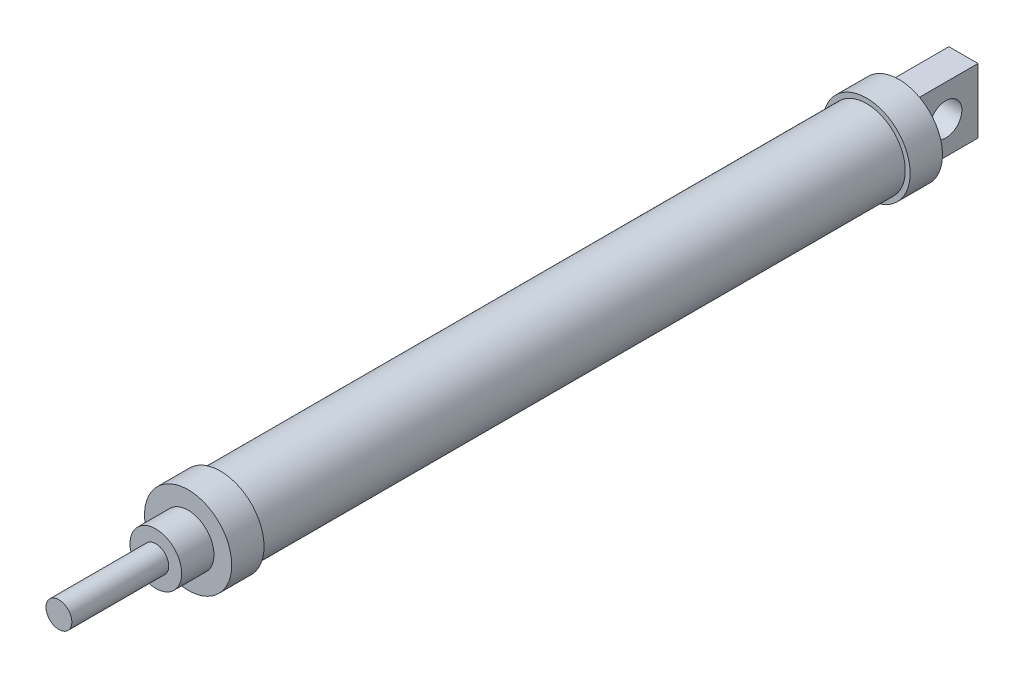
ISO-10303-21;
HEADER;
FILE_DESCRIPTION(('STEP AP214'),'2;1');
FILE_NAME('part.step','',(''),(''),'','','');
FILE_SCHEMA(('AUTOMOTIVE_DESIGN { 1 0 10303 214 1 1 1 1 }'));
ENDSEC;
DATA;
#1=APPLICATION_CONTEXT('core data for automotive mechanical design processes');
#2=APPLICATION_PROTOCOL_DEFINITION('international standard','automotive_design',2000,#1);
#3=PRODUCT_CONTEXT('',#1,'mechanical');
#4=PRODUCT('Part','Part','',(#3));
#5=PRODUCT_RELATED_PRODUCT_CATEGORY('part','',(#4));
#6=PRODUCT_DEFINITION_FORMATION('','',#4);
#7=PRODUCT_DEFINITION_CONTEXT('part definition',#1,'design');
#8=PRODUCT_DEFINITION('design','',#6,#7);
#9=PRODUCT_DEFINITION_SHAPE('','',#8);
#10=(LENGTH_UNIT() NAMED_UNIT(*) SI_UNIT(.MILLI.,.METRE.));
#11=(NAMED_UNIT(*) PLANE_ANGLE_UNIT() SI_UNIT($,.RADIAN.));
#12=(NAMED_UNIT(*) SI_UNIT($,.STERADIAN.) SOLID_ANGLE_UNIT());
#13=UNCERTAINTY_MEASURE_WITH_UNIT(LENGTH_MEASURE(1.E-05),#10,'distance_accuracy_value','');
#14=(GEOMETRIC_REPRESENTATION_CONTEXT(3) GLOBAL_UNCERTAINTY_ASSIGNED_CONTEXT((#13)) GLOBAL_UNIT_ASSIGNED_CONTEXT((#10,
#11,#12)) REPRESENTATION_CONTEXT('',''));
#15=CARTESIAN_POINT('',(0.,0.,0.));
#16=DIRECTION('',(0.,0.,1.));
#17=DIRECTION('',(1.,0.,0.));
#18=AXIS2_PLACEMENT_3D('',#15,#16,#17);
#19=CARTESIAN_POINT('',(0.,0.,10.));
#20=DIRECTION('',(0.,0.,-1.));
#21=DIRECTION('',(-1.,0.,0.));
#22=AXIS2_PLACEMENT_3D('',#19,#20,#21);
#23=CYLINDRICAL_SURFACE('',#22,13.5);
#24=CARTESIAN_POINT('',(0.,0.,10.));
#25=DIRECTION('',(0.,0.,1.));
#26=DIRECTION('',(1.,0.,0.));
#27=AXIS2_PLACEMENT_3D('',#24,#25,#26);
#28=CIRCLE('',#27,13.5);
#29=CARTESIAN_POINT('',(13.5,0.,10.));
#30=VERTEX_POINT('',#29);
#31=EDGE_CURVE('E120',#30,#30,#28,.T.);
#32=ORIENTED_EDGE('',*,*,#31,.F.);
#33=EDGE_LOOP('',(#32));
#34=FACE_BOUND('',#33,.T.);
#35=CARTESIAN_POINT('',(0.,0.,0.));
#36=DIRECTION('',(0.,0.,1.));
#37=DIRECTION('',(1.,0.,0.));
#38=AXIS2_PLACEMENT_3D('',#35,#36,#37);
#39=CIRCLE('',#38,13.5);
#40=CARTESIAN_POINT('',(13.5,0.,0.));
#41=VERTEX_POINT('',#40);
#42=EDGE_CURVE('E117',#41,#41,#39,.T.);
#43=ORIENTED_EDGE('',*,*,#42,.T.);
#44=EDGE_LOOP('',(#43));
#45=FACE_BOUND('',#44,.T.);
#46=ADVANCED_FACE('F35',(#34,#45),#23,.T.);
#47=CARTESIAN_POINT('',(0.,0.,10.));
#48=DIRECTION('',(0.,0.,1.));
#49=DIRECTION('',(1.,0.,0.));
#50=AXIS2_PLACEMENT_3D('',#47,#48,#49);
#51=PLANE('',#50);
#52=CARTESIAN_POINT('',(0.,0.,10.));
#53=DIRECTION('',(0.,0.,1.));
#54=DIRECTION('',(1.,0.,0.));
#55=AXIS2_PLACEMENT_3D('',#52,#53,#54);
#56=CIRCLE('',#55,8.);
#57=CARTESIAN_POINT('',(8.,0.,10.));
#58=VERTEX_POINT('',#57);
#59=EDGE_CURVE('E114',#58,#58,#56,.T.);
#60=ORIENTED_EDGE('',*,*,#59,.F.);
#61=EDGE_LOOP('',(#60));
#62=FACE_BOUND('',#61,.T.);
#63=ORIENTED_EDGE('',*,*,#31,.T.);
#64=EDGE_LOOP('',(#63));
#65=FACE_BOUND('',#64,.T.);
#66=ADVANCED_FACE('F129',(#62,#65),#51,.T.);
#67=CARTESIAN_POINT('',(0.,0.,0.));
#68=DIRECTION('',(0.,0.,1.));
#69=DIRECTION('',(1.,0.,0.));
#70=AXIS2_PLACEMENT_3D('',#67,#68,#69);
#71=PLANE('',#70);
#72=CARTESIAN_POINT('',(0.,0.,0.));
#73=DIRECTION('',(0.,0.,-1.));
#74=DIRECTION('',(-1.,0.,0.));
#75=AXIS2_PLACEMENT_3D('',#72,#73,#74);
#76=CIRCLE('',#75,12.);
#77=CARTESIAN_POINT('',(-12.,0.,0.));
#78=VERTEX_POINT('',#77);
#79=EDGE_CURVE('E43',#78,#78,#76,.T.);
#80=ORIENTED_EDGE('',*,*,#79,.F.);
#81=EDGE_LOOP('',(#80));
#82=FACE_BOUND('',#81,.T.);
#83=ORIENTED_EDGE('',*,*,#42,.F.);
#84=EDGE_LOOP('',(#83));
#85=FACE_BOUND('',#84,.T.);
#86=ADVANCED_FACE('F126',(#82,#85),#71,.F.);
#87=CARTESIAN_POINT('',(0.,0.,20.));
#88=DIRECTION('',(0.,0.,-1.));
#89=DIRECTION('',(-1.,0.,0.));
#90=AXIS2_PLACEMENT_3D('',#87,#88,#89);
#91=CYLINDRICAL_SURFACE('',#90,8.);
#92=CARTESIAN_POINT('',(0.,0.,20.));
#93=DIRECTION('',(0.,0.,1.));
#94=DIRECTION('',(1.,0.,0.));
#95=AXIS2_PLACEMENT_3D('',#92,#93,#94);
#96=CIRCLE('',#95,8.);
#97=CARTESIAN_POINT('',(8.,0.,20.));
#98=VERTEX_POINT('',#97);
#99=EDGE_CURVE('E111',#98,#98,#96,.T.);
#100=ORIENTED_EDGE('',*,*,#99,.F.);
#101=EDGE_LOOP('',(#100));
#102=FACE_BOUND('',#101,.T.);
#103=ORIENTED_EDGE('',*,*,#59,.T.);
#104=EDGE_LOOP('',(#103));
#105=FACE_BOUND('',#104,.T.);
#106=ADVANCED_FACE('F128',(#102,#105),#91,.T.);
#107=CARTESIAN_POINT('',(0.,0.,20.));
#108=DIRECTION('',(0.,0.,1.));
#109=DIRECTION('',(1.,0.,0.));
#110=AXIS2_PLACEMENT_3D('',#107,#108,#109);
#111=PLANE('',#110);
#112=CARTESIAN_POINT('',(0.,0.,20.));
#113=DIRECTION('',(0.,0.,1.));
#114=DIRECTION('',(1.,0.,0.));
#115=AXIS2_PLACEMENT_3D('',#112,#113,#114);
#116=CIRCLE('',#115,4.);
#117=CARTESIAN_POINT('',(4.,0.,20.));
#118=VERTEX_POINT('',#117);
#119=EDGE_CURVE('E11',#118,#118,#116,.T.);
#120=ORIENTED_EDGE('',*,*,#119,.F.);
#121=EDGE_LOOP('',(#120));
#122=FACE_BOUND('',#121,.T.);
#123=ORIENTED_EDGE('',*,*,#99,.T.);
#124=EDGE_LOOP('',(#123));
#125=FACE_BOUND('',#124,.T.);
#126=ADVANCED_FACE('F135',(#122,#125),#111,.T.);
#127=CARTESIAN_POINT('',(0.,0.,-200.));
#128=DIRECTION('',(0.,0.,1.));
#129=DIRECTION('',(1.,0.,0.));
#130=AXIS2_PLACEMENT_3D('',#127,#128,#129);
#131=CYLINDRICAL_SURFACE('',#130,12.);
#132=CARTESIAN_POINT('',(0.,0.,-200.));
#133=DIRECTION('',(0.,0.,-1.));
#134=DIRECTION('',(-1.,0.,0.));
#135=AXIS2_PLACEMENT_3D('',#132,#133,#134);
#136=CIRCLE('',#135,12.);
#137=CARTESIAN_POINT('',(-12.,0.,-200.));
#138=VERTEX_POINT('',#137);
#139=EDGE_CURVE('E107',#138,#138,#136,.T.);
#140=ORIENTED_EDGE('',*,*,#139,.F.);
#141=EDGE_LOOP('',(#140));
#142=FACE_BOUND('',#141,.T.);
#143=ORIENTED_EDGE('',*,*,#79,.T.);
#144=EDGE_LOOP('',(#143));
#145=FACE_BOUND('',#144,.T.);
#146=ADVANCED_FACE('F168',(#142,#145),#131,.T.);
#147=CARTESIAN_POINT('',(0.,0.,-210.));
#148=DIRECTION('',(0.,0.,1.));
#149=DIRECTION('',(1.,0.,0.));
#150=AXIS2_PLACEMENT_3D('',#147,#148,#149);
#151=CYLINDRICAL_SURFACE('',#150,13.5);
#152=CARTESIAN_POINT('',(0.,0.,-210.));
#153=DIRECTION('',(0.,0.,-1.));
#154=DIRECTION('',(-1.,0.,0.));
#155=AXIS2_PLACEMENT_3D('',#152,#153,#154);
#156=CIRCLE('',#155,13.5);
#157=CARTESIAN_POINT('',(-13.5,0.,-210.));
#158=VERTEX_POINT('',#157);
#159=EDGE_CURVE('E100',#158,#158,#156,.T.);
#160=ORIENTED_EDGE('',*,*,#159,.F.);
#161=EDGE_LOOP('',(#160));
#162=FACE_BOUND('',#161,.T.);
#163=CARTESIAN_POINT('',(0.,0.,-200.));
#164=DIRECTION('',(0.,0.,-1.));
#165=DIRECTION('',(-1.,0.,0.));
#166=AXIS2_PLACEMENT_3D('',#163,#164,#165);
#167=CIRCLE('',#166,13.5);
#168=CARTESIAN_POINT('',(-13.5,0.,-200.));
#169=VERTEX_POINT('',#168);
#170=EDGE_CURVE('E97',#169,#169,#167,.T.);
#171=ORIENTED_EDGE('',*,*,#170,.T.);
#172=EDGE_LOOP('',(#171));
#173=FACE_BOUND('',#172,.T.);
#174=ADVANCED_FACE('F173',(#162,#173),#151,.T.);
#175=CARTESIAN_POINT('',(0.,0.,-210.));
#176=DIRECTION('',(0.,0.,-1.));
#177=DIRECTION('',(-1.,0.,0.));
#178=AXIS2_PLACEMENT_3D('',#175,#176,#177);
#179=PLANE('',#178);
#180=DIRECTION('',(0.,-1.,0.));
#181=VECTOR('',#180,1.);
#182=CARTESIAN_POINT('',(4.5,-10.,-210.));
#183=LINE('',#182,#181);
#184=CARTESIAN_POINT('',(4.5,10.,-210.));
#185=VERTEX_POINT('',#184);
#186=CARTESIAN_POINT('',(4.5,-10.,-210.));
#187=VERTEX_POINT('',#186);
#188=EDGE_CURVE('E51',#185,#187,#183,.T.);
#189=ORIENTED_EDGE('',*,*,#188,.F.);
#190=DIRECTION('',(1.,0.,0.));
#191=VECTOR('',#190,1.);
#192=CARTESIAN_POINT('',(-4.5,10.,-210.));
#193=LINE('',#192,#191);
#194=CARTESIAN_POINT('',(-4.5,10.,-210.));
#195=VERTEX_POINT('',#194);
#196=EDGE_CURVE('E55',#195,#185,#193,.T.);
#197=ORIENTED_EDGE('',*,*,#196,.F.);
#198=DIRECTION('',(0.,1.,0.));
#199=VECTOR('',#198,1.);
#200=CARTESIAN_POINT('',(-4.5,-10.,-210.));
#201=LINE('',#200,#199);
#202=CARTESIAN_POINT('',(-4.5,-10.,-210.));
#203=VERTEX_POINT('',#202);
#204=EDGE_CURVE('E302',#203,#195,#201,.T.);
#205=ORIENTED_EDGE('',*,*,#204,.F.);
#206=DIRECTION('',(-1.,0.,0.));
#207=VECTOR('',#206,1.);
#208=CARTESIAN_POINT('',(-4.5,-10.,-210.));
#209=LINE('',#208,#207);
#210=EDGE_CURVE('E300',#187,#203,#209,.T.);
#211=ORIENTED_EDGE('',*,*,#210,.F.);
#212=EDGE_LOOP('',(#189,#197,#205,#211));
#213=FACE_BOUND('',#212,.T.);
#214=ORIENTED_EDGE('',*,*,#159,.T.);
#215=EDGE_LOOP('',(#214));
#216=FACE_BOUND('',#215,.T.);
#217=ADVANCED_FACE('F183',(#213,#216),#179,.T.);
#218=CARTESIAN_POINT('',(0.,0.,-200.));
#219=DIRECTION('',(0.,0.,-1.));
#220=DIRECTION('',(-1.,0.,0.));
#221=AXIS2_PLACEMENT_3D('',#218,#219,#220);
#222=PLANE('',#221);
#223=ORIENTED_EDGE('',*,*,#139,.T.);
#224=EDGE_LOOP('',(#223));
#225=FACE_BOUND('',#224,.T.);
#226=ORIENTED_EDGE('',*,*,#170,.F.);
#227=EDGE_LOOP('',(#226));
#228=FACE_BOUND('',#227,.T.);
#229=ADVANCED_FACE('F191',(#225,#228),#222,.F.);
#230=CARTESIAN_POINT('',(4.5,-10.,-230.));
#231=DIRECTION('',(-1.,0.,0.));
#232=DIRECTION('',(0.,-1.,0.));
#233=AXIS2_PLACEMENT_3D('',#230,#231,#232);
#234=PLANE('',#233);
#235=CARTESIAN_POINT('',(4.5,0.,-220.));
#236=DIRECTION('',(1.,0.,0.));
#237=DIRECTION('',(0.,1.,0.));
#238=AXIS2_PLACEMENT_3D('',#235,#236,#237);
#239=CIRCLE('',#238,4.99999999999999);
#240=CARTESIAN_POINT('',(4.5,4.99999999999999,-220.));
#241=VERTEX_POINT('',#240);
#242=EDGE_CURVE('E291',#241,#241,#239,.T.);
#243=ORIENTED_EDGE('',*,*,#242,.F.);
#244=EDGE_LOOP('',(#243));
#245=FACE_BOUND('',#244,.T.);
#246=ORIENTED_EDGE('',*,*,#188,.T.);
#247=DIRECTION('',(0.,0.,1.));
#248=VECTOR('',#247,1.);
#249=CARTESIAN_POINT('',(4.5,-10.,-230.));
#250=LINE('',#249,#248);
#251=CARTESIAN_POINT('',(4.5,-10.,-230.));
#252=VERTEX_POINT('',#251);
#253=EDGE_CURVE('E80',#252,#187,#250,.T.);
#254=ORIENTED_EDGE('',*,*,#253,.F.);
#255=DIRECTION('',(0.,-1.,0.));
#256=VECTOR('',#255,1.);
#257=CARTESIAN_POINT('',(4.5,-10.,-230.));
#258=LINE('',#257,#256);
#259=CARTESIAN_POINT('',(4.5,10.,-230.));
#260=VERTEX_POINT('',#259);
#261=EDGE_CURVE('E86',#260,#252,#258,.T.);
#262=ORIENTED_EDGE('',*,*,#261,.F.);
#263=DIRECTION('',(0.,0.,1.));
#264=VECTOR('',#263,1.);
#265=CARTESIAN_POINT('',(4.5,10.,-230.));
#266=LINE('',#265,#264);
#267=EDGE_CURVE('E298',#260,#185,#266,.T.);
#268=ORIENTED_EDGE('',*,*,#267,.T.);
#269=EDGE_LOOP('',(#246,#254,#262,#268));
#270=FACE_BOUND('',#269,.T.);
#271=ADVANCED_FACE('F96',(#245,#270),#234,.F.);
#272=CARTESIAN_POINT('',(-4.5,-10.,-230.));
#273=DIRECTION('',(0.,1.,0.));
#274=DIRECTION('',(-1.,0.,0.));
#275=AXIS2_PLACEMENT_3D('',#272,#273,#274);
#276=PLANE('',#275);
#277=ORIENTED_EDGE('',*,*,#210,.T.);
#278=DIRECTION('',(0.,0.,1.));
#279=VECTOR('',#278,1.);
#280=CARTESIAN_POINT('',(-4.5,-10.,-230.));
#281=LINE('',#280,#279);
#282=CARTESIAN_POINT('',(-4.5,-10.,-230.));
#283=VERTEX_POINT('',#282);
#284=EDGE_CURVE('E82',#283,#203,#281,.T.);
#285=ORIENTED_EDGE('',*,*,#284,.F.);
#286=DIRECTION('',(-1.,0.,0.));
#287=VECTOR('',#286,1.);
#288=CARTESIAN_POINT('',(-4.5,-10.,-230.));
#289=LINE('',#288,#287);
#290=EDGE_CURVE('E75',#252,#283,#289,.T.);
#291=ORIENTED_EDGE('',*,*,#290,.F.);
#292=ORIENTED_EDGE('',*,*,#253,.T.);
#293=EDGE_LOOP('',(#277,#285,#291,#292));
#294=FACE_BOUND('',#293,.T.);
#295=ADVANCED_FACE('F78',(#294),#276,.F.);
#296=CARTESIAN_POINT('',(-4.5,-10.,-230.));
#297=DIRECTION('',(1.,0.,0.));
#298=DIRECTION('',(0.,0.,-1.));
#299=AXIS2_PLACEMENT_3D('',#296,#297,#298);
#300=PLANE('',#299);
#301=CARTESIAN_POINT('',(-4.5,0.,-220.));
#302=DIRECTION('',(1.,0.,0.));
#303=DIRECTION('',(0.,0.,-1.));
#304=AXIS2_PLACEMENT_3D('',#301,#302,#303);
#305=CIRCLE('',#304,4.99999999999999);
#306=CARTESIAN_POINT('',(-4.5,0.,-225.));
#307=VERTEX_POINT('',#306);
#308=EDGE_CURVE('E38',#307,#307,#305,.T.);
#309=ORIENTED_EDGE('',*,*,#308,.T.);
#310=EDGE_LOOP('',(#309));
#311=FACE_BOUND('',#310,.T.);
#312=ORIENTED_EDGE('',*,*,#204,.T.);
#313=DIRECTION('',(0.,0.,1.));
#314=VECTOR('',#313,1.);
#315=CARTESIAN_POINT('',(-4.5,10.,-230.));
#316=LINE('',#315,#314);
#317=CARTESIAN_POINT('',(-4.5,10.,-230.));
#318=VERTEX_POINT('',#317);
#319=EDGE_CURVE('E102',#318,#195,#316,.T.);
#320=ORIENTED_EDGE('',*,*,#319,.F.);
#321=DIRECTION('',(0.,1.,0.));
#322=VECTOR('',#321,1.);
#323=CARTESIAN_POINT('',(-4.5,-10.,-230.));
#324=LINE('',#323,#322);
#325=EDGE_CURVE('E85',#283,#318,#324,.T.);
#326=ORIENTED_EDGE('',*,*,#325,.F.);
#327=ORIENTED_EDGE('',*,*,#284,.T.);
#328=EDGE_LOOP('',(#312,#320,#326,#327));
#329=FACE_BOUND('',#328,.T.);
#330=ADVANCED_FACE('F213',(#311,#329),#300,.F.);
#331=CARTESIAN_POINT('',(-4.5,10.,-230.));
#332=DIRECTION('',(0.,-1.,0.));
#333=DIRECTION('',(0.,0.,-1.));
#334=AXIS2_PLACEMENT_3D('',#331,#332,#333);
#335=PLANE('',#334);
#336=ORIENTED_EDGE('',*,*,#196,.T.);
#337=ORIENTED_EDGE('',*,*,#267,.F.);
#338=DIRECTION('',(1.,0.,0.));
#339=VECTOR('',#338,1.);
#340=CARTESIAN_POINT('',(-4.5,10.,-230.));
#341=LINE('',#340,#339);
#342=EDGE_CURVE('E91',#318,#260,#341,.T.);
#343=ORIENTED_EDGE('',*,*,#342,.F.);
#344=ORIENTED_EDGE('',*,*,#319,.T.);
#345=EDGE_LOOP('',(#336,#337,#343,#344));
#346=FACE_BOUND('',#345,.T.);
#347=ADVANCED_FACE('F220',(#346),#335,.F.);
#348=CARTESIAN_POINT('',(0.,0.,-230.));
#349=DIRECTION('',(0.,0.,-1.));
#350=DIRECTION('',(-1.,0.,0.));
#351=AXIS2_PLACEMENT_3D('',#348,#349,#350);
#352=PLANE('',#351);
#353=ORIENTED_EDGE('',*,*,#261,.T.);
#354=ORIENTED_EDGE('',*,*,#290,.T.);
#355=ORIENTED_EDGE('',*,*,#325,.T.);
#356=ORIENTED_EDGE('',*,*,#342,.T.);
#357=EDGE_LOOP('',(#353,#354,#355,#356));
#358=FACE_BOUND('',#357,.T.);
#359=ADVANCED_FACE('F89',(#358),#352,.T.);
#360=CARTESIAN_POINT('',(-15.5,0.,-220.));
#361=DIRECTION('',(1.,0.,0.));
#362=DIRECTION('',(0.,1.,0.));
#363=AXIS2_PLACEMENT_3D('',#360,#361,#362);
#364=CYLINDRICAL_SURFACE('',#363,4.99999999999999);
#365=ORIENTED_EDGE('',*,*,#242,.T.);
#366=EDGE_LOOP('',(#365));
#367=FACE_BOUND('',#366,.T.);
#368=ORIENTED_EDGE('',*,*,#308,.F.);
#369=EDGE_LOOP('',(#368));
#370=FACE_BOUND('',#369,.T.);
#371=ADVANCED_FACE('F234',(#367,#370),#364,.F.);
#372=CARTESIAN_POINT('',(0.,0.,50.));
#373=DIRECTION('',(0.,0.,-1.));
#374=DIRECTION('',(-1.,0.,0.));
#375=AXIS2_PLACEMENT_3D('',#372,#373,#374);
#376=CYLINDRICAL_SURFACE('',#375,4.);
#377=CARTESIAN_POINT('',(0.,0.,50.));
#378=DIRECTION('',(0.,0.,1.));
#379=DIRECTION('',(1.,0.,0.));
#380=AXIS2_PLACEMENT_3D('',#377,#378,#379);
#381=CIRCLE('',#380,4.);
#382=CARTESIAN_POINT('',(4.,0.,50.));
#383=VERTEX_POINT('',#382);
#384=EDGE_CURVE('E290',#383,#383,#381,.T.);
#385=ORIENTED_EDGE('',*,*,#384,.F.);
#386=EDGE_LOOP('',(#385));
#387=FACE_BOUND('',#386,.T.);
#388=ORIENTED_EDGE('',*,*,#119,.T.);
#389=EDGE_LOOP('',(#388));
#390=FACE_BOUND('',#389,.T.);
#391=ADVANCED_FACE('F257',(#387,#390),#376,.T.);
#392=CARTESIAN_POINT('',(0.,0.,50.));
#393=DIRECTION('',(0.,0.,1.));
#394=DIRECTION('',(1.,0.,0.));
#395=AXIS2_PLACEMENT_3D('',#392,#393,#394);
#396=PLANE('',#395);
#397=ORIENTED_EDGE('',*,*,#384,.T.);
#398=EDGE_LOOP('',(#397));
#399=FACE_BOUND('',#398,.T.);
#400=ADVANCED_FACE('F274',(#399),#396,.T.);
#401=CLOSED_SHELL('',(#46,#66,#86,#106,#126,#146,#174,#217,#229,#271,#295,#330,#347,#359,#371,
#391,#400));
#402=MANIFOLD_SOLID_BREP('B2',#401);
#403=ADVANCED_BREP_SHAPE_REPRESENTATION('',(#18,#402),#14);
#404=SHAPE_DEFINITION_REPRESENTATION(#9,#403);
ENDSEC;
END-ISO-10303-21;
